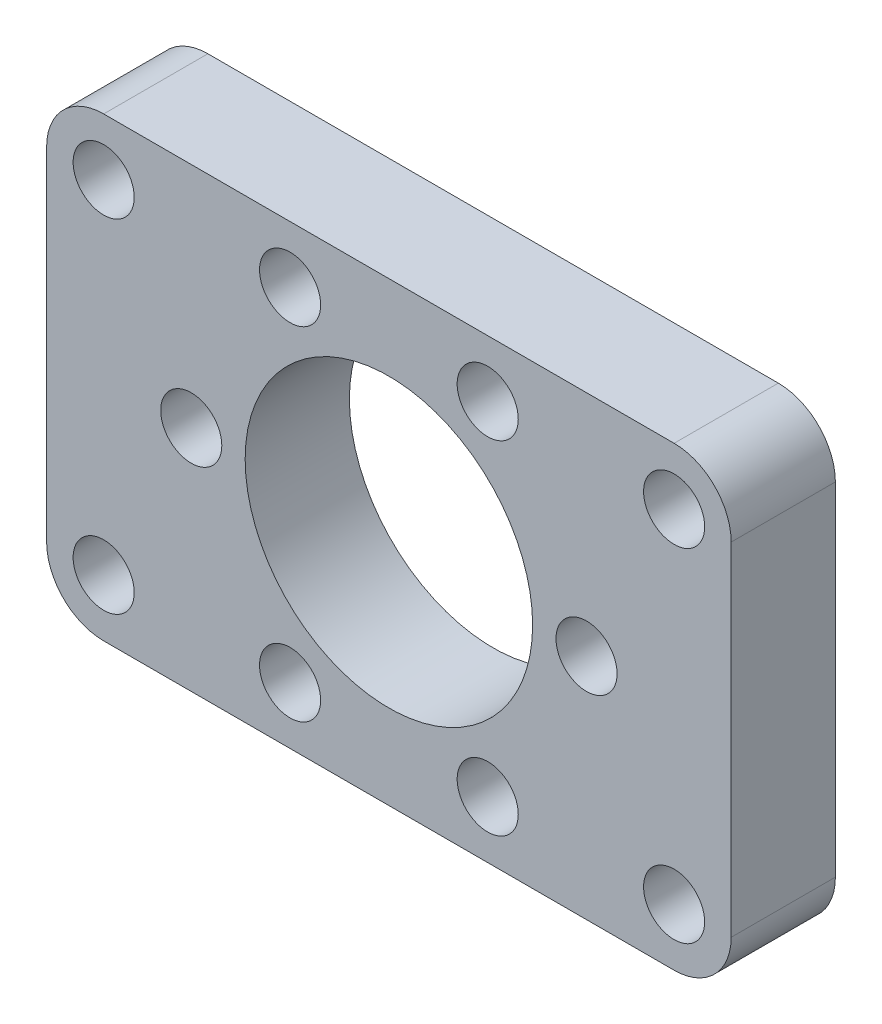
ISO-10303-21;
HEADER;
FILE_DESCRIPTION(('STEP AP214'),'2;1');
FILE_NAME('part.step','',(''),(''),'','','');
FILE_SCHEMA(('AUTOMOTIVE_DESIGN { 1 0 10303 214 1 1 1 1 }'));
ENDSEC;
DATA;
#1=APPLICATION_CONTEXT('core data for automotive mechanical design processes');
#2=APPLICATION_PROTOCOL_DEFINITION('international standard','automotive_design',2000,#1);
#3=PRODUCT_CONTEXT('',#1,'mechanical');
#4=PRODUCT('Part','Part','',(#3));
#5=PRODUCT_RELATED_PRODUCT_CATEGORY('part','',(#4));
#6=PRODUCT_DEFINITION_FORMATION('','',#4);
#7=PRODUCT_DEFINITION_CONTEXT('part definition',#1,'design');
#8=PRODUCT_DEFINITION('design','',#6,#7);
#9=PRODUCT_DEFINITION_SHAPE('','',#8);
#10=(LENGTH_UNIT() NAMED_UNIT(*) SI_UNIT(.MILLI.,.METRE.));
#11=(NAMED_UNIT(*) PLANE_ANGLE_UNIT() SI_UNIT($,.RADIAN.));
#12=(NAMED_UNIT(*) SI_UNIT($,.STERADIAN.) SOLID_ANGLE_UNIT());
#13=UNCERTAINTY_MEASURE_WITH_UNIT(LENGTH_MEASURE(1.E-05),#10,'distance_accuracy_value','');
#14=(GEOMETRIC_REPRESENTATION_CONTEXT(3) GLOBAL_UNCERTAINTY_ASSIGNED_CONTEXT((#13)) GLOBAL_UNIT_ASSIGNED_CONTEXT((#10,
#11,#12)) REPRESENTATION_CONTEXT('',''));
#15=CARTESIAN_POINT('',(0.,0.,0.));
#16=DIRECTION('',(0.,0.,1.));
#17=DIRECTION('',(1.,0.,0.));
#18=AXIS2_PLACEMENT_3D('',#15,#16,#17);
#19=CARTESIAN_POINT('',(0.,0.,5.8));
#20=DIRECTION('',(1.,0.,0.));
#21=DIRECTION('',(0.,0.,-1.));
#22=AXIS2_PLACEMENT_3D('',#19,#20,#21);
#23=PLANE('',#22);
#24=DIRECTION('',(0.,-1.,0.));
#25=VECTOR('',#24,1.);
#26=CARTESIAN_POINT('',(0.,0.,0.));
#27=LINE('',#26,#25);
#28=CARTESIAN_POINT('',(0.,22.225,0.));
#29=VERTEX_POINT('',#28);
#30=CARTESIAN_POINT('',(0.,3.175,0.));
#31=VERTEX_POINT('',#30);
#32=EDGE_CURVE('E128',#29,#31,#27,.T.);
#33=ORIENTED_EDGE('',*,*,#32,.T.);
#34=DIRECTION('',(0.,0.,-1.));
#35=VECTOR('',#34,1.);
#36=CARTESIAN_POINT('',(0.,3.175,5.8));
#37=LINE('',#36,#35);
#38=CARTESIAN_POINT('',(0.,3.175,5.8));
#39=VERTEX_POINT('',#38);
#40=EDGE_CURVE('E106',#31,#39,#37,.F.);
#41=ORIENTED_EDGE('',*,*,#40,.T.);
#42=DIRECTION('',(0.,-1.,0.));
#43=VECTOR('',#42,1.);
#44=CARTESIAN_POINT('',(0.,0.,5.8));
#45=LINE('',#44,#43);
#46=CARTESIAN_POINT('',(0.,22.225,5.8));
#47=VERTEX_POINT('',#46);
#48=EDGE_CURVE('E138',#47,#39,#45,.T.);
#49=ORIENTED_EDGE('',*,*,#48,.F.);
#50=DIRECTION('',(0.,0.,-1.));
#51=VECTOR('',#50,1.);
#52=CARTESIAN_POINT('',(0.,22.225,5.8));
#53=LINE('',#52,#51);
#54=EDGE_CURVE('E111',#47,#29,#53,.T.);
#55=ORIENTED_EDGE('',*,*,#54,.T.);
#56=EDGE_LOOP('',(#33,#41,#49,#55));
#57=FACE_BOUND('',#56,.T.);
#58=ADVANCED_FACE('F35',(#57),#23,.F.);
#59=CARTESIAN_POINT('',(0.,0.,5.8));
#60=DIRECTION('',(0.,1.,0.));
#61=DIRECTION('',(0.,0.,1.));
#62=AXIS2_PLACEMENT_3D('',#59,#60,#61);
#63=PLANE('',#62);
#64=DIRECTION('',(1.,0.,0.));
#65=VECTOR('',#64,1.);
#66=CARTESIAN_POINT('',(0.,0.,5.8));
#67=LINE('',#66,#65);
#68=CARTESIAN_POINT('',(3.175,0.,5.8));
#69=VERTEX_POINT('',#68);
#70=CARTESIAN_POINT('',(34.925,0.,5.8));
#71=VERTEX_POINT('',#70);
#72=EDGE_CURVE('E121',#69,#71,#67,.T.);
#73=ORIENTED_EDGE('',*,*,#72,.F.);
#74=DIRECTION('',(0.,0.,-1.));
#75=VECTOR('',#74,1.);
#76=CARTESIAN_POINT('',(3.175,0.,5.8));
#77=LINE('',#76,#75);
#78=CARTESIAN_POINT('',(3.175,0.,0.));
#79=VERTEX_POINT('',#78);
#80=EDGE_CURVE('E105',#69,#79,#77,.T.);
#81=ORIENTED_EDGE('',*,*,#80,.T.);
#82=DIRECTION('',(1.,0.,0.));
#83=VECTOR('',#82,1.);
#84=CARTESIAN_POINT('',(0.,0.,0.));
#85=LINE('',#84,#83);
#86=CARTESIAN_POINT('',(34.925,0.,0.));
#87=VERTEX_POINT('',#86);
#88=EDGE_CURVE('E118',#79,#87,#85,.T.);
#89=ORIENTED_EDGE('',*,*,#88,.T.);
#90=DIRECTION('',(0.,0.,-1.));
#91=VECTOR('',#90,1.);
#92=CARTESIAN_POINT('',(34.925,0.,5.8));
#93=LINE('',#92,#91);
#94=EDGE_CURVE('E123',#87,#71,#93,.F.);
#95=ORIENTED_EDGE('',*,*,#94,.T.);
#96=EDGE_LOOP('',(#73,#81,#89,#95));
#97=FACE_BOUND('',#96,.T.);
#98=ADVANCED_FACE('F117',(#97),#63,.F.);
#99=CARTESIAN_POINT('',(38.1,0.,5.8));
#100=DIRECTION('',(-1.,0.,0.));
#101=DIRECTION('',(0.,0.,1.));
#102=AXIS2_PLACEMENT_3D('',#99,#100,#101);
#103=PLANE('',#102);
#104=DIRECTION('',(0.,1.,0.));
#105=VECTOR('',#104,1.);
#106=CARTESIAN_POINT('',(38.1,0.,0.));
#107=LINE('',#106,#105);
#108=CARTESIAN_POINT('',(38.1,3.175,0.));
#109=VERTEX_POINT('',#108);
#110=CARTESIAN_POINT('',(38.1,22.225,0.));
#111=VERTEX_POINT('',#110);
#112=EDGE_CURVE('E127',#109,#111,#107,.T.);
#113=ORIENTED_EDGE('',*,*,#112,.T.);
#114=DIRECTION('',(0.,0.,-1.));
#115=VECTOR('',#114,1.);
#116=CARTESIAN_POINT('',(38.1,22.225,5.8));
#117=LINE('',#116,#115);
#118=CARTESIAN_POINT('',(38.1,22.225,5.8));
#119=VERTEX_POINT('',#118);
#120=EDGE_CURVE('E11',#111,#119,#117,.F.);
#121=ORIENTED_EDGE('',*,*,#120,.T.);
#122=DIRECTION('',(0.,1.,0.));
#123=VECTOR('',#122,1.);
#124=CARTESIAN_POINT('',(38.1,0.,5.8));
#125=LINE('',#124,#123);
#126=CARTESIAN_POINT('',(38.1,3.175,5.8));
#127=VERTEX_POINT('',#126);
#128=EDGE_CURVE('E174',#127,#119,#125,.T.);
#129=ORIENTED_EDGE('',*,*,#128,.F.);
#130=DIRECTION('',(0.,0.,-1.));
#131=VECTOR('',#130,1.);
#132=CARTESIAN_POINT('',(38.1,3.175,5.8));
#133=LINE('',#132,#131);
#134=EDGE_CURVE('E43',#127,#109,#133,.T.);
#135=ORIENTED_EDGE('',*,*,#134,.T.);
#136=EDGE_LOOP('',(#113,#121,#129,#135));
#137=FACE_BOUND('',#136,.T.);
#138=ADVANCED_FACE('F172',(#137),#103,.F.);
#139=CARTESIAN_POINT('',(0.,25.4,5.8));
#140=DIRECTION('',(0.,-1.,0.));
#141=DIRECTION('',(0.,0.,-1.));
#142=AXIS2_PLACEMENT_3D('',#139,#140,#141);
#143=PLANE('',#142);
#144=DIRECTION('',(-1.,0.,0.));
#145=VECTOR('',#144,1.);
#146=CARTESIAN_POINT('',(0.,25.4,0.));
#147=LINE('',#146,#145);
#148=CARTESIAN_POINT('',(34.925,25.4,0.));
#149=VERTEX_POINT('',#148);
#150=CARTESIAN_POINT('',(3.175,25.4,0.));
#151=VERTEX_POINT('',#150);
#152=EDGE_CURVE('E131',#149,#151,#147,.T.);
#153=ORIENTED_EDGE('',*,*,#152,.T.);
#154=DIRECTION('',(0.,0.,-1.));
#155=VECTOR('',#154,1.);
#156=CARTESIAN_POINT('',(3.175,25.4,5.8));
#157=LINE('',#156,#155);
#158=CARTESIAN_POINT('',(3.175,25.4,5.8));
#159=VERTEX_POINT('',#158);
#160=EDGE_CURVE('E50',#151,#159,#157,.F.);
#161=ORIENTED_EDGE('',*,*,#160,.T.);
#162=DIRECTION('',(-1.,0.,0.));
#163=VECTOR('',#162,1.);
#164=CARTESIAN_POINT('',(0.,25.4,5.8));
#165=LINE('',#164,#163);
#166=CARTESIAN_POINT('',(34.925,25.4,5.8));
#167=VERTEX_POINT('',#166);
#168=EDGE_CURVE('E149',#167,#159,#165,.T.);
#169=ORIENTED_EDGE('',*,*,#168,.F.);
#170=DIRECTION('',(0.,0.,-1.));
#171=VECTOR('',#170,1.);
#172=CARTESIAN_POINT('',(34.925,25.4,5.8));
#173=LINE('',#172,#171);
#174=EDGE_CURVE('E165',#167,#149,#173,.T.);
#175=ORIENTED_EDGE('',*,*,#174,.T.);
#176=EDGE_LOOP('',(#153,#161,#169,#175));
#177=FACE_BOUND('',#176,.T.);
#178=ADVANCED_FACE('F181',(#177),#143,.F.);
#179=CARTESIAN_POINT('',(0.,25.4,5.8));
#180=DIRECTION('',(0.,0.,-1.));
#181=DIRECTION('',(-1.,0.,0.));
#182=AXIS2_PLACEMENT_3D('',#179,#180,#181);
#183=PLANE('',#182);
#184=CARTESIAN_POINT('',(3.175,22.225,5.8));
#185=DIRECTION('',(0.,0.,1.));
#186=DIRECTION('',(1.,0.,0.));
#187=AXIS2_PLACEMENT_3D('',#184,#185,#186);
#188=CIRCLE('',#187,1.69999999999999);
#189=CARTESIAN_POINT('',(4.87499999999999,22.225,5.8));
#190=VERTEX_POINT('',#189);
#191=EDGE_CURVE('E240',#190,#190,#188,.T.);
#192=ORIENTED_EDGE('',*,*,#191,.F.);
#193=EDGE_LOOP('',(#192));
#194=FACE_BOUND('',#193,.T.);
#195=CARTESIAN_POINT('',(34.925,22.225,5.8));
#196=DIRECTION('',(0.,0.,1.));
#197=DIRECTION('',(1.,0.,0.));
#198=AXIS2_PLACEMENT_3D('',#195,#196,#197);
#199=CIRCLE('',#198,1.69999999999999);
#200=CARTESIAN_POINT('',(36.625,22.225,5.8));
#201=VERTEX_POINT('',#200);
#202=EDGE_CURVE('E148',#201,#201,#199,.T.);
#203=ORIENTED_EDGE('',*,*,#202,.F.);
#204=EDGE_LOOP('',(#203));
#205=FACE_BOUND('',#204,.T.);
#206=CARTESIAN_POINT('',(34.925,3.175,5.8));
#207=DIRECTION('',(0.,0.,1.));
#208=DIRECTION('',(1.,0.,0.));
#209=AXIS2_PLACEMENT_3D('',#206,#207,#208);
#210=CIRCLE('',#209,1.69999999999999);
#211=CARTESIAN_POINT('',(36.625,3.175,5.8));
#212=VERTEX_POINT('',#211);
#213=EDGE_CURVE('E147',#212,#212,#210,.T.);
#214=ORIENTED_EDGE('',*,*,#213,.F.);
#215=EDGE_LOOP('',(#214));
#216=FACE_BOUND('',#215,.T.);
#217=CARTESIAN_POINT('',(3.175,3.17500000000001,5.8));
#218=DIRECTION('',(0.,0.,1.));
#219=DIRECTION('',(1.,0.,0.));
#220=AXIS2_PLACEMENT_3D('',#217,#218,#219);
#221=CIRCLE('',#220,1.69999999999999);
#222=CARTESIAN_POINT('',(4.87499999999999,3.17500000000001,5.8));
#223=VERTEX_POINT('',#222);
#224=EDGE_CURVE('E227',#223,#223,#221,.T.);
#225=ORIENTED_EDGE('',*,*,#224,.F.);
#226=EDGE_LOOP('',(#225));
#227=FACE_BOUND('',#226,.T.);
#228=CARTESIAN_POINT('',(30.05,12.7,5.8));
#229=DIRECTION('',(0.,0.,1.));
#230=DIRECTION('',(1.,0.,0.));
#231=AXIS2_PLACEMENT_3D('',#228,#229,#230);
#232=CIRCLE('',#231,1.69999999999999);
#233=CARTESIAN_POINT('',(31.75,12.7,5.8));
#234=VERTEX_POINT('',#233);
#235=EDGE_CURVE('E221',#234,#234,#232,.T.);
#236=ORIENTED_EDGE('',*,*,#235,.F.);
#237=EDGE_LOOP('',(#236));
#238=FACE_BOUND('',#237,.T.);
#239=CARTESIAN_POINT('',(24.55,22.2262794416288,5.8));
#240=DIRECTION('',(0.,0.,1.));
#241=DIRECTION('',(1.,0.,0.));
#242=AXIS2_PLACEMENT_3D('',#239,#240,#241);
#243=CIRCLE('',#242,1.69999999999999);
#244=CARTESIAN_POINT('',(26.25,22.2262794416288,5.8));
#245=VERTEX_POINT('',#244);
#246=EDGE_CURVE('E143',#245,#245,#243,.T.);
#247=ORIENTED_EDGE('',*,*,#246,.F.);
#248=EDGE_LOOP('',(#247));
#249=FACE_BOUND('',#248,.T.);
#250=CARTESIAN_POINT('',(13.55,22.2262794416288,5.8));
#251=DIRECTION('',(0.,0.,1.));
#252=DIRECTION('',(1.,0.,0.));
#253=AXIS2_PLACEMENT_3D('',#250,#251,#252);
#254=CIRCLE('',#253,1.69999999999999);
#255=CARTESIAN_POINT('',(15.25,22.2262794416288,5.8));
#256=VERTEX_POINT('',#255);
#257=EDGE_CURVE('E142',#256,#256,#254,.T.);
#258=ORIENTED_EDGE('',*,*,#257,.F.);
#259=EDGE_LOOP('',(#258));
#260=FACE_BOUND('',#259,.T.);
#261=CARTESIAN_POINT('',(8.05,12.7,5.8));
#262=DIRECTION('',(0.,0.,1.));
#263=DIRECTION('',(1.,0.,0.));
#264=AXIS2_PLACEMENT_3D('',#261,#262,#263);
#265=CIRCLE('',#264,1.69999999999999);
#266=CARTESIAN_POINT('',(9.74999999999999,12.7,5.8));
#267=VERTEX_POINT('',#266);
#268=EDGE_CURVE('E208',#267,#267,#265,.T.);
#269=ORIENTED_EDGE('',*,*,#268,.F.);
#270=EDGE_LOOP('',(#269));
#271=FACE_BOUND('',#270,.T.);
#272=CARTESIAN_POINT('',(13.55,3.17372055837118,5.8));
#273=DIRECTION('',(0.,0.,1.));
#274=DIRECTION('',(1.,0.,0.));
#275=AXIS2_PLACEMENT_3D('',#272,#273,#274);
#276=CIRCLE('',#275,1.69999999999999);
#277=CARTESIAN_POINT('',(15.25,3.17372055837118,5.8));
#278=VERTEX_POINT('',#277);
#279=EDGE_CURVE('E202',#278,#278,#276,.T.);
#280=ORIENTED_EDGE('',*,*,#279,.F.);
#281=EDGE_LOOP('',(#280));
#282=FACE_BOUND('',#281,.T.);
#283=CARTESIAN_POINT('',(24.55,3.17372055837117,5.8));
#284=DIRECTION('',(0.,0.,1.));
#285=DIRECTION('',(1.,0.,0.));
#286=AXIS2_PLACEMENT_3D('',#283,#284,#285);
#287=CIRCLE('',#286,1.69999999999999);
#288=CARTESIAN_POINT('',(26.25,3.17372055837117,5.8));
#289=VERTEX_POINT('',#288);
#290=EDGE_CURVE('E196',#289,#289,#287,.T.);
#291=ORIENTED_EDGE('',*,*,#290,.F.);
#292=EDGE_LOOP('',(#291));
#293=FACE_BOUND('',#292,.T.);
#294=CARTESIAN_POINT('',(19.05,12.7,5.8));
#295=DIRECTION('',(0.,0.,1.));
#296=DIRECTION('',(1.,0.,0.));
#297=AXIS2_PLACEMENT_3D('',#294,#295,#296);
#298=CIRCLE('',#297,8.);
#299=CARTESIAN_POINT('',(27.05,12.7,5.8));
#300=VERTEX_POINT('',#299);
#301=EDGE_CURVE('E188',#300,#300,#298,.T.);
#302=ORIENTED_EDGE('',*,*,#301,.F.);
#303=EDGE_LOOP('',(#302));
#304=FACE_BOUND('',#303,.T.);
#305=ORIENTED_EDGE('',*,*,#48,.T.);
#306=CARTESIAN_POINT('',(3.175,3.175,5.8));
#307=DIRECTION('',(0.,0.,-1.));
#308=DIRECTION('',(-1.,0.,0.));
#309=AXIS2_PLACEMENT_3D('',#306,#307,#308);
#310=CIRCLE('',#309,3.175);
#311=EDGE_CURVE('E163',#39,#69,#310,.F.);
#312=ORIENTED_EDGE('',*,*,#311,.T.);
#313=ORIENTED_EDGE('',*,*,#72,.T.);
#314=CARTESIAN_POINT('',(34.925,3.175,5.8));
#315=DIRECTION('',(0.,0.,-1.));
#316=DIRECTION('',(-1.,0.,0.));
#317=AXIS2_PLACEMENT_3D('',#314,#315,#316);
#318=CIRCLE('',#317,3.175);
#319=EDGE_CURVE('E158',#71,#127,#318,.F.);
#320=ORIENTED_EDGE('',*,*,#319,.T.);
#321=ORIENTED_EDGE('',*,*,#128,.T.);
#322=CARTESIAN_POINT('',(34.925,22.225,5.8));
#323=DIRECTION('',(0.,0.,-1.));
#324=DIRECTION('',(-1.,0.,0.));
#325=AXIS2_PLACEMENT_3D('',#322,#323,#324);
#326=CIRCLE('',#325,3.175);
#327=EDGE_CURVE('E57',#119,#167,#326,.F.);
#328=ORIENTED_EDGE('',*,*,#327,.T.);
#329=ORIENTED_EDGE('',*,*,#168,.T.);
#330=CARTESIAN_POINT('',(3.175,22.225,5.8));
#331=DIRECTION('',(0.,0.,-1.));
#332=DIRECTION('',(-1.,0.,0.));
#333=AXIS2_PLACEMENT_3D('',#330,#331,#332);
#334=CIRCLE('',#333,3.175);
#335=EDGE_CURVE('E161',#159,#47,#334,.F.);
#336=ORIENTED_EDGE('',*,*,#335,.T.);
#337=EDGE_LOOP('',(#305,#312,#313,#320,#321,#328,#329,#336));
#338=FACE_BOUND('',#337,.T.);
#339=ADVANCED_FACE('F246',(#194,#205,#216,#227,#238,#249,#260,#271,#282,#293,#304,#338),#183,.F.);
#340=CARTESIAN_POINT('',(0.,25.4,0.));
#341=DIRECTION('',(0.,0.,-1.));
#342=DIRECTION('',(-1.,0.,0.));
#343=AXIS2_PLACEMENT_3D('',#340,#341,#342);
#344=PLANE('',#343);
#345=CARTESIAN_POINT('',(3.175,22.225,0.));
#346=DIRECTION('',(0.,0.,-1.));
#347=DIRECTION('',(-1.,0.,0.));
#348=AXIS2_PLACEMENT_3D('',#345,#346,#347);
#349=CIRCLE('',#348,1.69999999999999);
#350=CARTESIAN_POINT('',(1.47500000000001,22.225,0.));
#351=VERTEX_POINT('',#350);
#352=EDGE_CURVE('E237',#351,#351,#349,.T.);
#353=ORIENTED_EDGE('',*,*,#352,.F.);
#354=EDGE_LOOP('',(#353));
#355=FACE_BOUND('',#354,.T.);
#356=CARTESIAN_POINT('',(34.925,22.225,0.));
#357=DIRECTION('',(0.,0.,-1.));
#358=DIRECTION('',(-1.,0.,0.));
#359=AXIS2_PLACEMENT_3D('',#356,#357,#358);
#360=CIRCLE('',#359,1.69999999999999);
#361=CARTESIAN_POINT('',(33.225,22.225,0.));
#362=VERTEX_POINT('',#361);
#363=EDGE_CURVE('E144',#362,#362,#360,.T.);
#364=ORIENTED_EDGE('',*,*,#363,.F.);
#365=EDGE_LOOP('',(#364));
#366=FACE_BOUND('',#365,.T.);
#367=CARTESIAN_POINT('',(34.925,3.175,0.));
#368=DIRECTION('',(0.,0.,-1.));
#369=DIRECTION('',(-1.,0.,0.));
#370=AXIS2_PLACEMENT_3D('',#367,#368,#369);
#371=CIRCLE('',#370,1.69999999999999);
#372=CARTESIAN_POINT('',(33.225,3.175,0.));
#373=VERTEX_POINT('',#372);
#374=EDGE_CURVE('E230',#373,#373,#371,.T.);
#375=ORIENTED_EDGE('',*,*,#374,.F.);
#376=EDGE_LOOP('',(#375));
#377=FACE_BOUND('',#376,.T.);
#378=CARTESIAN_POINT('',(3.175,3.17500000000001,0.));
#379=DIRECTION('',(0.,0.,-1.));
#380=DIRECTION('',(-1.,0.,0.));
#381=AXIS2_PLACEMENT_3D('',#378,#379,#380);
#382=CIRCLE('',#381,1.69999999999999);
#383=CARTESIAN_POINT('',(1.47500000000001,3.17500000000001,0.));
#384=VERTEX_POINT('',#383);
#385=EDGE_CURVE('E224',#384,#384,#382,.T.);
#386=ORIENTED_EDGE('',*,*,#385,.F.);
#387=EDGE_LOOP('',(#386));
#388=FACE_BOUND('',#387,.T.);
#389=CARTESIAN_POINT('',(30.05,12.7,0.));
#390=DIRECTION('',(0.,0.,-1.));
#391=DIRECTION('',(-1.,0.,0.));
#392=AXIS2_PLACEMENT_3D('',#389,#390,#391);
#393=CIRCLE('',#392,1.69999999999999);
#394=CARTESIAN_POINT('',(28.35,12.7,0.));
#395=VERTEX_POINT('',#394);
#396=EDGE_CURVE('E218',#395,#395,#393,.T.);
#397=ORIENTED_EDGE('',*,*,#396,.F.);
#398=EDGE_LOOP('',(#397));
#399=FACE_BOUND('',#398,.T.);
#400=CARTESIAN_POINT('',(24.55,22.2262794416288,0.));
#401=DIRECTION('',(0.,0.,-1.));
#402=DIRECTION('',(-1.,0.,0.));
#403=AXIS2_PLACEMENT_3D('',#400,#401,#402);
#404=CIRCLE('',#403,1.69999999999999);
#405=CARTESIAN_POINT('',(22.85,22.2262794416288,0.));
#406=VERTEX_POINT('',#405);
#407=EDGE_CURVE('E139',#406,#406,#404,.T.);
#408=ORIENTED_EDGE('',*,*,#407,.F.);
#409=EDGE_LOOP('',(#408));
#410=FACE_BOUND('',#409,.T.);
#411=CARTESIAN_POINT('',(13.55,22.2262794416288,0.));
#412=DIRECTION('',(0.,0.,-1.));
#413=DIRECTION('',(-1.,0.,0.));
#414=AXIS2_PLACEMENT_3D('',#411,#412,#413);
#415=CIRCLE('',#414,1.69999999999999);
#416=CARTESIAN_POINT('',(11.85,22.2262794416288,0.));
#417=VERTEX_POINT('',#416);
#418=EDGE_CURVE('E211',#417,#417,#415,.T.);
#419=ORIENTED_EDGE('',*,*,#418,.F.);
#420=EDGE_LOOP('',(#419));
#421=FACE_BOUND('',#420,.T.);
#422=CARTESIAN_POINT('',(8.05,12.7,0.));
#423=DIRECTION('',(0.,0.,-1.));
#424=DIRECTION('',(-1.,0.,0.));
#425=AXIS2_PLACEMENT_3D('',#422,#423,#424);
#426=CIRCLE('',#425,1.69999999999999);
#427=CARTESIAN_POINT('',(6.35000000000001,12.7,0.));
#428=VERTEX_POINT('',#427);
#429=EDGE_CURVE('E205',#428,#428,#426,.T.);
#430=ORIENTED_EDGE('',*,*,#429,.F.);
#431=EDGE_LOOP('',(#430));
#432=FACE_BOUND('',#431,.T.);
#433=CARTESIAN_POINT('',(13.55,3.17372055837118,0.));
#434=DIRECTION('',(0.,0.,-1.));
#435=DIRECTION('',(-1.,0.,0.));
#436=AXIS2_PLACEMENT_3D('',#433,#434,#435);
#437=CIRCLE('',#436,1.69999999999999);
#438=CARTESIAN_POINT('',(11.85,3.17372055837118,0.));
#439=VERTEX_POINT('',#438);
#440=EDGE_CURVE('E199',#439,#439,#437,.T.);
#441=ORIENTED_EDGE('',*,*,#440,.F.);
#442=EDGE_LOOP('',(#441));
#443=FACE_BOUND('',#442,.T.);
#444=CARTESIAN_POINT('',(24.55,3.17372055837117,0.));
#445=DIRECTION('',(0.,0.,-1.));
#446=DIRECTION('',(-1.,0.,0.));
#447=AXIS2_PLACEMENT_3D('',#444,#445,#446);
#448=CIRCLE('',#447,1.69999999999999);
#449=CARTESIAN_POINT('',(22.85,3.17372055837117,0.));
#450=VERTEX_POINT('',#449);
#451=EDGE_CURVE('E191',#450,#450,#448,.T.);
#452=ORIENTED_EDGE('',*,*,#451,.F.);
#453=EDGE_LOOP('',(#452));
#454=FACE_BOUND('',#453,.T.);
#455=CARTESIAN_POINT('',(19.05,12.7,0.));
#456=DIRECTION('',(0.,0.,1.));
#457=DIRECTION('',(1.,0.,0.));
#458=AXIS2_PLACEMENT_3D('',#455,#456,#457);
#459=CIRCLE('',#458,8.);
#460=CARTESIAN_POINT('',(27.05,12.7,0.));
#461=VERTEX_POINT('',#460);
#462=EDGE_CURVE('E133',#461,#461,#459,.T.);
#463=ORIENTED_EDGE('',*,*,#462,.T.);
#464=EDGE_LOOP('',(#463));
#465=FACE_BOUND('',#464,.T.);
#466=ORIENTED_EDGE('',*,*,#88,.F.);
#467=CARTESIAN_POINT('',(3.175,3.175,0.));
#468=DIRECTION('',(0.,0.,-1.));
#469=DIRECTION('',(-1.,0.,0.));
#470=AXIS2_PLACEMENT_3D('',#467,#468,#469);
#471=CIRCLE('',#470,3.175);
#472=EDGE_CURVE('E101',#79,#31,#471,.T.);
#473=ORIENTED_EDGE('',*,*,#472,.T.);
#474=ORIENTED_EDGE('',*,*,#32,.F.);
#475=CARTESIAN_POINT('',(3.175,22.225,0.));
#476=DIRECTION('',(0.,0.,-1.));
#477=DIRECTION('',(-1.,0.,0.));
#478=AXIS2_PLACEMENT_3D('',#475,#476,#477);
#479=CIRCLE('',#478,3.175);
#480=EDGE_CURVE('E112',#29,#151,#479,.T.);
#481=ORIENTED_EDGE('',*,*,#480,.T.);
#482=ORIENTED_EDGE('',*,*,#152,.F.);
#483=CARTESIAN_POINT('',(34.925,22.225,0.));
#484=DIRECTION('',(0.,0.,-1.));
#485=DIRECTION('',(-1.,0.,0.));
#486=AXIS2_PLACEMENT_3D('',#483,#484,#485);
#487=CIRCLE('',#486,3.175);
#488=EDGE_CURVE('E152',#149,#111,#487,.T.);
#489=ORIENTED_EDGE('',*,*,#488,.T.);
#490=ORIENTED_EDGE('',*,*,#112,.F.);
#491=CARTESIAN_POINT('',(34.925,3.175,0.));
#492=DIRECTION('',(0.,0.,-1.));
#493=DIRECTION('',(-1.,0.,0.));
#494=AXIS2_PLACEMENT_3D('',#491,#492,#493);
#495=CIRCLE('',#494,3.175);
#496=EDGE_CURVE('E122',#109,#87,#495,.T.);
#497=ORIENTED_EDGE('',*,*,#496,.T.);
#498=EDGE_LOOP('',(#466,#473,#474,#481,#482,#489,#490,#497));
#499=FACE_BOUND('',#498,.T.);
#500=ADVANCED_FACE('F125',(#355,#366,#377,#388,#399,#410,#421,#432,#443,#454,#465,#499),#344,.T.);
#501=CARTESIAN_POINT('',(19.05,12.7,0.));
#502=DIRECTION('',(0.,0.,1.));
#503=DIRECTION('',(1.,0.,0.));
#504=AXIS2_PLACEMENT_3D('',#501,#502,#503);
#505=CYLINDRICAL_SURFACE('',#504,8.);
#506=ORIENTED_EDGE('',*,*,#462,.F.);
#507=EDGE_LOOP('',(#506));
#508=FACE_BOUND('',#507,.T.);
#509=ORIENTED_EDGE('',*,*,#301,.T.);
#510=EDGE_LOOP('',(#509));
#511=FACE_BOUND('',#510,.T.);
#512=ADVANCED_FACE('F293',(#508,#511),#505,.F.);
#513=CARTESIAN_POINT('',(24.55,3.17372055837117,5.8));
#514=DIRECTION('',(0.,0.,1.));
#515=DIRECTION('',(1.,0.,0.));
#516=AXIS2_PLACEMENT_3D('',#513,#514,#515);
#517=CYLINDRICAL_SURFACE('',#516,1.69999999999999);
#518=ORIENTED_EDGE('',*,*,#451,.T.);
#519=EDGE_LOOP('',(#518));
#520=FACE_BOUND('',#519,.T.);
#521=ORIENTED_EDGE('',*,*,#290,.T.);
#522=EDGE_LOOP('',(#521));
#523=FACE_BOUND('',#522,.T.);
#524=ADVANCED_FACE('F298',(#520,#523),#517,.F.);
#525=CARTESIAN_POINT('',(13.55,3.17372055837118,5.8));
#526=DIRECTION('',(0.,0.,1.));
#527=DIRECTION('',(1.,0.,0.));
#528=AXIS2_PLACEMENT_3D('',#525,#526,#527);
#529=CYLINDRICAL_SURFACE('',#528,1.69999999999999);
#530=ORIENTED_EDGE('',*,*,#440,.T.);
#531=EDGE_LOOP('',(#530));
#532=FACE_BOUND('',#531,.T.);
#533=ORIENTED_EDGE('',*,*,#279,.T.);
#534=EDGE_LOOP('',(#533));
#535=FACE_BOUND('',#534,.T.);
#536=ADVANCED_FACE('F302',(#532,#535),#529,.F.);
#537=CARTESIAN_POINT('',(8.05,12.7,5.8));
#538=DIRECTION('',(0.,0.,1.));
#539=DIRECTION('',(1.,0.,0.));
#540=AXIS2_PLACEMENT_3D('',#537,#538,#539);
#541=CYLINDRICAL_SURFACE('',#540,1.69999999999999);
#542=ORIENTED_EDGE('',*,*,#429,.T.);
#543=EDGE_LOOP('',(#542));
#544=FACE_BOUND('',#543,.T.);
#545=ORIENTED_EDGE('',*,*,#268,.T.);
#546=EDGE_LOOP('',(#545));
#547=FACE_BOUND('',#546,.T.);
#548=ADVANCED_FACE('F306',(#544,#547),#541,.F.);
#549=CARTESIAN_POINT('',(13.55,22.2262794416288,5.8));
#550=DIRECTION('',(0.,0.,1.));
#551=DIRECTION('',(1.,0.,0.));
#552=AXIS2_PLACEMENT_3D('',#549,#550,#551);
#553=CYLINDRICAL_SURFACE('',#552,1.69999999999999);
#554=ORIENTED_EDGE('',*,*,#418,.T.);
#555=EDGE_LOOP('',(#554));
#556=FACE_BOUND('',#555,.T.);
#557=ORIENTED_EDGE('',*,*,#257,.T.);
#558=EDGE_LOOP('',(#557));
#559=FACE_BOUND('',#558,.T.);
#560=ADVANCED_FACE('F310',(#556,#559),#553,.F.);
#561=CARTESIAN_POINT('',(24.55,22.2262794416288,5.8));
#562=DIRECTION('',(0.,0.,1.));
#563=DIRECTION('',(1.,0.,0.));
#564=AXIS2_PLACEMENT_3D('',#561,#562,#563);
#565=CYLINDRICAL_SURFACE('',#564,1.69999999999999);
#566=ORIENTED_EDGE('',*,*,#407,.T.);
#567=EDGE_LOOP('',(#566));
#568=FACE_BOUND('',#567,.T.);
#569=ORIENTED_EDGE('',*,*,#246,.T.);
#570=EDGE_LOOP('',(#569));
#571=FACE_BOUND('',#570,.T.);
#572=ADVANCED_FACE('F314',(#568,#571),#565,.F.);
#573=CARTESIAN_POINT('',(30.05,12.7,5.8));
#574=DIRECTION('',(0.,0.,1.));
#575=DIRECTION('',(1.,0.,0.));
#576=AXIS2_PLACEMENT_3D('',#573,#574,#575);
#577=CYLINDRICAL_SURFACE('',#576,1.69999999999999);
#578=ORIENTED_EDGE('',*,*,#396,.T.);
#579=EDGE_LOOP('',(#578));
#580=FACE_BOUND('',#579,.T.);
#581=ORIENTED_EDGE('',*,*,#235,.T.);
#582=EDGE_LOOP('',(#581));
#583=FACE_BOUND('',#582,.T.);
#584=ADVANCED_FACE('F318',(#580,#583),#577,.F.);
#585=CARTESIAN_POINT('',(3.175,3.17500000000001,5.8));
#586=DIRECTION('',(0.,0.,1.));
#587=DIRECTION('',(1.,0.,0.));
#588=AXIS2_PLACEMENT_3D('',#585,#586,#587);
#589=CYLINDRICAL_SURFACE('',#588,1.69999999999999);
#590=ORIENTED_EDGE('',*,*,#385,.T.);
#591=EDGE_LOOP('',(#590));
#592=FACE_BOUND('',#591,.T.);
#593=ORIENTED_EDGE('',*,*,#224,.T.);
#594=EDGE_LOOP('',(#593));
#595=FACE_BOUND('',#594,.T.);
#596=ADVANCED_FACE('F322',(#592,#595),#589,.F.);
#597=CARTESIAN_POINT('',(34.925,3.175,5.8));
#598=DIRECTION('',(0.,0.,1.));
#599=DIRECTION('',(1.,0.,0.));
#600=AXIS2_PLACEMENT_3D('',#597,#598,#599);
#601=CYLINDRICAL_SURFACE('',#600,1.69999999999999);
#602=ORIENTED_EDGE('',*,*,#374,.T.);
#603=EDGE_LOOP('',(#602));
#604=FACE_BOUND('',#603,.T.);
#605=ORIENTED_EDGE('',*,*,#213,.T.);
#606=EDGE_LOOP('',(#605));
#607=FACE_BOUND('',#606,.T.);
#608=ADVANCED_FACE('F326',(#604,#607),#601,.F.);
#609=CARTESIAN_POINT('',(34.925,22.225,5.8));
#610=DIRECTION('',(0.,0.,1.));
#611=DIRECTION('',(1.,0.,0.));
#612=AXIS2_PLACEMENT_3D('',#609,#610,#611);
#613=CYLINDRICAL_SURFACE('',#612,1.69999999999999);
#614=ORIENTED_EDGE('',*,*,#363,.T.);
#615=EDGE_LOOP('',(#614));
#616=FACE_BOUND('',#615,.T.);
#617=ORIENTED_EDGE('',*,*,#202,.T.);
#618=EDGE_LOOP('',(#617));
#619=FACE_BOUND('',#618,.T.);
#620=ADVANCED_FACE('F330',(#616,#619),#613,.F.);
#621=CARTESIAN_POINT('',(3.175,22.225,5.8));
#622=DIRECTION('',(0.,0.,1.));
#623=DIRECTION('',(1.,0.,0.));
#624=AXIS2_PLACEMENT_3D('',#621,#622,#623);
#625=CYLINDRICAL_SURFACE('',#624,1.69999999999999);
#626=ORIENTED_EDGE('',*,*,#352,.T.);
#627=EDGE_LOOP('',(#626));
#628=FACE_BOUND('',#627,.T.);
#629=ORIENTED_EDGE('',*,*,#191,.T.);
#630=EDGE_LOOP('',(#629));
#631=FACE_BOUND('',#630,.T.);
#632=ADVANCED_FACE('F244',(#628,#631),#625,.F.);
#633=CARTESIAN_POINT('',(3.175,3.175,5.8));
#634=DIRECTION('',(0.,0.,-1.));
#635=DIRECTION('',(-1.,0.,0.));
#636=AXIS2_PLACEMENT_3D('',#633,#634,#635);
#637=CYLINDRICAL_SURFACE('',#636,3.175);
#638=ORIENTED_EDGE('',*,*,#311,.F.);
#639=ORIENTED_EDGE('',*,*,#40,.F.);
#640=ORIENTED_EDGE('',*,*,#472,.F.);
#641=ORIENTED_EDGE('',*,*,#80,.F.);
#642=EDGE_LOOP('',(#638,#639,#640,#641));
#643=FACE_BOUND('',#642,.T.);
#644=ADVANCED_FACE('F104',(#643),#637,.T.);
#645=CARTESIAN_POINT('',(3.175,22.225,5.8));
#646=DIRECTION('',(0.,0.,-1.));
#647=DIRECTION('',(-1.,0.,0.));
#648=AXIS2_PLACEMENT_3D('',#645,#646,#647);
#649=CYLINDRICAL_SURFACE('',#648,3.175);
#650=ORIENTED_EDGE('',*,*,#335,.F.);
#651=ORIENTED_EDGE('',*,*,#160,.F.);
#652=ORIENTED_EDGE('',*,*,#480,.F.);
#653=ORIENTED_EDGE('',*,*,#54,.F.);
#654=EDGE_LOOP('',(#650,#651,#652,#653));
#655=FACE_BOUND('',#654,.T.);
#656=ADVANCED_FACE('F273',(#655),#649,.T.);
#657=CARTESIAN_POINT('',(34.925,22.225,5.8));
#658=DIRECTION('',(0.,0.,-1.));
#659=DIRECTION('',(-1.,0.,0.));
#660=AXIS2_PLACEMENT_3D('',#657,#658,#659);
#661=CYLINDRICAL_SURFACE('',#660,3.175);
#662=ORIENTED_EDGE('',*,*,#327,.F.);
#663=ORIENTED_EDGE('',*,*,#120,.F.);
#664=ORIENTED_EDGE('',*,*,#488,.F.);
#665=ORIENTED_EDGE('',*,*,#174,.F.);
#666=EDGE_LOOP('',(#662,#663,#664,#665));
#667=FACE_BOUND('',#666,.T.);
#668=ADVANCED_FACE('F180',(#667),#661,.T.);
#669=CARTESIAN_POINT('',(34.925,3.175,5.8));
#670=DIRECTION('',(0.,0.,-1.));
#671=DIRECTION('',(-1.,0.,0.));
#672=AXIS2_PLACEMENT_3D('',#669,#670,#671);
#673=CYLINDRICAL_SURFACE('',#672,3.175);
#674=ORIENTED_EDGE('',*,*,#319,.F.);
#675=ORIENTED_EDGE('',*,*,#94,.F.);
#676=ORIENTED_EDGE('',*,*,#496,.F.);
#677=ORIENTED_EDGE('',*,*,#134,.F.);
#678=EDGE_LOOP('',(#674,#675,#676,#677));
#679=FACE_BOUND('',#678,.T.);
#680=ADVANCED_FACE('F37',(#679),#673,.T.);
#681=CLOSED_SHELL('',(#58,#98,#138,#178,#339,#500,#512,#524,#536,#548,#560,#572,#584,#596,#608,
#620,#632,#644,#656,#668,#680));
#682=MANIFOLD_SOLID_BREP('B2',#681);
#683=ADVANCED_BREP_SHAPE_REPRESENTATION('',(#18,#682),#14);
#684=SHAPE_DEFINITION_REPRESENTATION(#9,#683);
ENDSEC;
END-ISO-10303-21;
